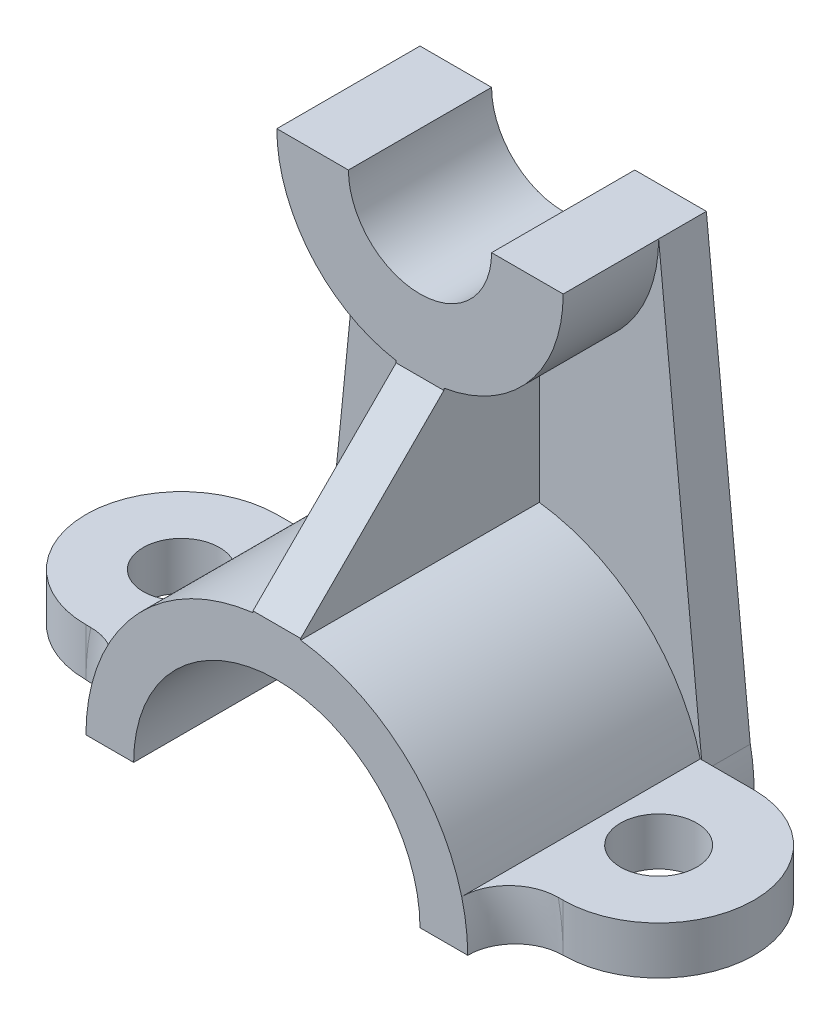
ISO-10303-21;
HEADER;
FILE_DESCRIPTION(('STEP AP214'),'2;1');
FILE_NAME('part.step','',(''),(''),'','','');
FILE_SCHEMA(('AUTOMOTIVE_DESIGN { 1 0 10303 214 1 1 1 1 }'));
ENDSEC;
DATA;
#1=APPLICATION_CONTEXT('core data for automotive mechanical design processes');
#2=APPLICATION_PROTOCOL_DEFINITION('international standard','automotive_design',2000,#1);
#3=PRODUCT_CONTEXT('',#1,'mechanical');
#4=PRODUCT('Part','Part','',(#3));
#5=PRODUCT_RELATED_PRODUCT_CATEGORY('part','',(#4));
#6=PRODUCT_DEFINITION_FORMATION('','',#4);
#7=PRODUCT_DEFINITION_CONTEXT('part definition',#1,'design');
#8=PRODUCT_DEFINITION('design','',#6,#7);
#9=PRODUCT_DEFINITION_SHAPE('','',#8);
#10=(LENGTH_UNIT() NAMED_UNIT(*) SI_UNIT(.MILLI.,.METRE.));
#11=(NAMED_UNIT(*) PLANE_ANGLE_UNIT() SI_UNIT($,.RADIAN.));
#12=(NAMED_UNIT(*) SI_UNIT($,.STERADIAN.) SOLID_ANGLE_UNIT());
#13=UNCERTAINTY_MEASURE_WITH_UNIT(LENGTH_MEASURE(1.E-05),#10,'distance_accuracy_value','');
#14=(GEOMETRIC_REPRESENTATION_CONTEXT(3) GLOBAL_UNCERTAINTY_ASSIGNED_CONTEXT((#13)) GLOBAL_UNIT_ASSIGNED_CONTEXT((#10,
#11,#12)) REPRESENTATION_CONTEXT('',''));
#15=CARTESIAN_POINT('',(0.,0.,0.));
#16=DIRECTION('',(0.,0.,1.));
#17=DIRECTION('',(1.,0.,0.));
#18=AXIS2_PLACEMENT_3D('',#15,#16,#17);
#19=CARTESIAN_POINT('',(0.,0.,-60.));
#20=DIRECTION('',(0.,0.,1.));
#21=DIRECTION('',(1.,0.,0.));
#22=AXIS2_PLACEMENT_3D('',#19,#20,#21);
#23=CYLINDRICAL_SURFACE('',#22,40.);
#24=CARTESIAN_POINT('',(0.,0.,-50.));
#25=DIRECTION('',(0.,0.,-1.));
#26=DIRECTION('',(-1.,0.,0.));
#27=AXIS2_PLACEMENT_3D('',#24,#25,#26);
#28=CIRCLE('',#27,40.);
#29=CARTESIAN_POINT('',(5.,39.6862696659689,-50.));
#30=VERTEX_POINT('',#29);
#31=CARTESIAN_POINT('',(38.7298334620742,10.,-50.));
#32=VERTEX_POINT('',#31);
#33=EDGE_CURVE('E304',#30,#32,#28,.T.);
#34=ORIENTED_EDGE('',*,*,#33,.F.);
#35=DIRECTION('',(0.,0.,1.));
#36=VECTOR('',#35,1.);
#37=CARTESIAN_POINT('',(5.,39.6862696659689,-60.));
#38=LINE('',#37,#36);
#39=CARTESIAN_POINT('',(5.,39.6862696659689,0.));
#40=VERTEX_POINT('',#39);
#41=EDGE_CURVE('E61',#30,#40,#38,.T.);
#42=ORIENTED_EDGE('',*,*,#41,.T.);
#43=CARTESIAN_POINT('',(0.,0.,0.));
#44=DIRECTION('',(0.,0.,1.));
#45=DIRECTION('',(1.,0.,0.));
#46=AXIS2_PLACEMENT_3D('',#43,#44,#45);
#47=CIRCLE('',#46,40.);
#48=CARTESIAN_POINT('',(38.7298334620742,10.,0.));
#49=VERTEX_POINT('',#48);
#50=EDGE_CURVE('E406',#49,#40,#47,.T.);
#51=ORIENTED_EDGE('',*,*,#50,.F.);
#52=DIRECTION('',(0.,0.,1.));
#53=VECTOR('',#52,1.);
#54=CARTESIAN_POINT('',(38.7298334620742,10.,-60.));
#55=LINE('',#54,#53);
#56=EDGE_CURVE('E411',#49,#32,#55,.F.);
#57=ORIENTED_EDGE('',*,*,#56,.T.);
#58=EDGE_LOOP('',(#34,#42,#51,#57));
#59=FACE_BOUND('',#58,.T.);
#60=ADVANCED_FACE('F37',(#59),#23,.T.);
#61=CARTESIAN_POINT('',(0.,0.,-50.));
#62=DIRECTION('',(0.,0.,-1.));
#63=DIRECTION('',(-1.,0.,0.));
#64=AXIS2_PLACEMENT_3D('',#61,#62,#63);
#65=PLANE('',#64);
#66=DIRECTION('',(0.,1.,0.));
#67=VECTOR('',#66,1.);
#68=CARTESIAN_POINT('',(5.,39.,-50.));
#69=LINE('',#68,#67);
#70=CARTESIAN_POINT('',(5.,70.4195685601603,-50.));
#71=VERTEX_POINT('',#70);
#72=EDGE_CURVE('E229',#30,#71,#69,.T.);
#73=ORIENTED_EDGE('',*,*,#72,.F.);
#74=ORIENTED_EDGE('',*,*,#33,.T.);
#75=DIRECTION('',(1.,0.,0.));
#76=VECTOR('',#75,1.);
#77=CARTESIAN_POINT('',(50.,10.,-50.));
#78=LINE('',#77,#76);
#79=CARTESIAN_POINT('',(39.,10.,-50.));
#80=VERTEX_POINT('',#79);
#81=EDGE_CURVE('E323',#32,#80,#78,.T.);
#82=ORIENTED_EDGE('',*,*,#81,.T.);
#83=DIRECTION('',(-0.099503719020999,0.995037190209989,0.));
#84=VECTOR('',#83,1.);
#85=CARTESIAN_POINT('',(39.6039603960396,3.96039603960396,-50.));
#86=LINE('',#85,#84);
#87=CARTESIAN_POINT('',(30.00003206772,99.9996793228004,-50.));
#88=VERTEX_POINT('',#87);
#89=EDGE_CURVE('E300',#80,#88,#86,.T.);
#90=ORIENTED_EDGE('',*,*,#89,.T.);
#91=CARTESIAN_POINT('',(0.,100.,-50.));
#92=DIRECTION('',(0.,0.,-1.));
#93=DIRECTION('',(-1.,0.,0.));
#94=AXIS2_PLACEMENT_3D('',#91,#92,#93);
#95=CIRCLE('',#94,30.0000320694338);
#96=EDGE_CURVE('E297',#88,#71,#95,.T.);
#97=ORIENTED_EDGE('',*,*,#96,.T.);
#98=EDGE_LOOP('',(#73,#74,#82,#90,#97));
#99=FACE_BOUND('',#98,.T.);
#100=ADVANCED_FACE('F497',(#99),#65,.F.);
#101=CARTESIAN_POINT('',(0.,100.,-30.));
#102=DIRECTION('',(0.,0.,-1.));
#103=DIRECTION('',(-1.,0.,0.));
#104=AXIS2_PLACEMENT_3D('',#101,#102,#103);
#105=CYLINDRICAL_SURFACE('',#104,30.0000320694338);
#106=CARTESIAN_POINT('',(0.,100.,-30.));
#107=DIRECTION('',(0.,0.,-1.));
#108=DIRECTION('',(-1.,0.,0.));
#109=AXIS2_PLACEMENT_3D('',#106,#107,#108);
#110=CIRCLE('',#109,30.0000320694338);
#111=CARTESIAN_POINT('',(30.00003206772,99.9996793228004,-30.));
#112=VERTEX_POINT('',#111);
#113=CARTESIAN_POINT('',(5.,70.4195685601603,-30.));
#114=VERTEX_POINT('',#113);
#115=EDGE_CURVE('E291',#112,#114,#110,.T.);
#116=ORIENTED_EDGE('',*,*,#115,.T.);
#117=DIRECTION('',(0.,0.,-1.));
#118=VECTOR('',#117,1.);
#119=CARTESIAN_POINT('',(5.,70.4195685601603,-30.));
#120=LINE('',#119,#118);
#121=EDGE_CURVE('E226',#114,#71,#120,.T.);
#122=ORIENTED_EDGE('',*,*,#121,.T.);
#123=ORIENTED_EDGE('',*,*,#96,.F.);
#124=DIRECTION('',(0.,0.,-1.));
#125=VECTOR('',#124,1.);
#126=CARTESIAN_POINT('',(30.00003206772,99.9996793228004,-30.));
#127=LINE('',#126,#125);
#128=EDGE_CURVE('E293',#112,#88,#127,.T.);
#129=ORIENTED_EDGE('',*,*,#128,.F.);
#130=EDGE_LOOP('',(#116,#122,#123,#129));
#131=FACE_BOUND('',#130,.T.);
#132=ADVANCED_FACE('F502',(#131),#105,.T.);
#133=CARTESIAN_POINT('',(0.,0.,-60.));
#134=DIRECTION('',(0.,0.,1.));
#135=DIRECTION('',(1.,0.,0.));
#136=AXIS2_PLACEMENT_3D('',#133,#134,#135);
#137=CIRCLE('',#136,40.);
#138=CARTESIAN_POINT('',(40.,0.,-60.));
#139=VERTEX_POINT('',#138);
#140=CARTESIAN_POINT('',(39.2079207920792,7.92079207920776,-60.));
#141=VERTEX_POINT('',#140);
#142=EDGE_CURVE('E394',#139,#141,#137,.T.);
#143=ORIENTED_EDGE('',*,*,#142,.T.);
#144=DIRECTION('',(0.,0.,-1.));
#145=VECTOR('',#144,1.);
#146=CARTESIAN_POINT('',(39.2079207920792,7.92079207920781,-50.));
#147=LINE('',#146,#145);
#148=CARTESIAN_POINT('',(39.2079207920792,7.9207920792079,-50.));
#149=VERTEX_POINT('',#148);
#150=EDGE_CURVE('E324',#149,#141,#147,.T.);
#151=ORIENTED_EDGE('',*,*,#150,.F.);
#152=CARTESIAN_POINT('',(0.,0.,-50.));
#153=DIRECTION('',(0.,0.,1.));
#154=DIRECTION('',(1.,0.,0.));
#155=AXIS2_PLACEMENT_3D('',#152,#153,#154);
#156=CIRCLE('',#155,40.);
#157=CARTESIAN_POINT('',(40.,0.,-50.));
#158=VERTEX_POINT('',#157);
#159=EDGE_CURVE('E421',#149,#158,#156,.F.);
#160=ORIENTED_EDGE('',*,*,#159,.T.);
#161=DIRECTION('',(0.,0.,1.));
#162=VECTOR('',#161,1.);
#163=CARTESIAN_POINT('',(40.,0.,-60.));
#164=LINE('',#163,#162);
#165=EDGE_CURVE('E398',#139,#158,#164,.T.);
#166=ORIENTED_EDGE('',*,*,#165,.F.);
#167=EDGE_LOOP('',(#143,#151,#160,#166));
#168=FACE_BOUND('',#167,.T.);
#169=ADVANCED_FACE('F498',(#168),#23,.T.);
#170=DIRECTION('',(0.,0.,1.));
#171=VECTOR('',#170,1.);
#172=CARTESIAN_POINT('',(-5.,39.6862696659689,-60.));
#173=LINE('',#172,#171);
#174=CARTESIAN_POINT('',(-5.,39.6862696659689,-50.));
#175=VERTEX_POINT('',#174);
#176=CARTESIAN_POINT('',(-5.,39.6862696659689,0.));
#177=VERTEX_POINT('',#176);
#178=EDGE_CURVE('E261',#175,#177,#173,.T.);
#179=ORIENTED_EDGE('',*,*,#178,.F.);
#180=CARTESIAN_POINT('',(-38.7298334620742,10.,-50.));
#181=VERTEX_POINT('',#180);
#182=EDGE_CURVE('E305',#181,#175,#28,.T.);
#183=ORIENTED_EDGE('',*,*,#182,.F.);
#184=DIRECTION('',(0.,0.,1.));
#185=VECTOR('',#184,1.);
#186=CARTESIAN_POINT('',(-38.7298334620742,10.,-60.));
#187=LINE('',#186,#185);
#188=CARTESIAN_POINT('',(-38.7298334620742,10.,0.));
#189=VERTEX_POINT('',#188);
#190=EDGE_CURVE('E423',#189,#181,#187,.F.);
#191=ORIENTED_EDGE('',*,*,#190,.F.);
#192=EDGE_CURVE('E53',#177,#189,#47,.T.);
#193=ORIENTED_EDGE('',*,*,#192,.F.);
#194=EDGE_LOOP('',(#179,#183,#191,#193));
#195=FACE_BOUND('',#194,.T.);
#196=ADVANCED_FACE('F495',(#195),#23,.T.);
#197=CARTESIAN_POINT('',(50.,0.,-50.));
#198=DIRECTION('',(0.,0.,1.));
#199=DIRECTION('',(1.,0.,0.));
#200=AXIS2_PLACEMENT_3D('',#197,#198,#199);
#201=PLANE('',#200);
#202=EDGE_CURVE('E302',#149,#80,#86,.T.);
#203=ORIENTED_EDGE('',*,*,#202,.T.);
#204=DIRECTION('',(-1.,0.,0.));
#205=VECTOR('',#204,1.);
#206=CARTESIAN_POINT('',(50.,10.,-50.));
#207=LINE('',#206,#205);
#208=CARTESIAN_POINT('',(50.,10.,-50.));
#209=VERTEX_POINT('',#208);
#210=EDGE_CURVE('E381',#209,#80,#207,.T.);
#211=ORIENTED_EDGE('',*,*,#210,.F.);
#212=DIRECTION('',(0.,1.,0.));
#213=VECTOR('',#212,1.);
#214=CARTESIAN_POINT('',(50.,0.,-50.));
#215=LINE('',#214,#213);
#216=CARTESIAN_POINT('',(50.,0.,-50.));
#217=VERTEX_POINT('',#216);
#218=EDGE_CURVE('E375',#217,#209,#215,.T.);
#219=ORIENTED_EDGE('',*,*,#218,.F.);
#220=DIRECTION('',(-1.,0.,0.));
#221=VECTOR('',#220,1.);
#222=CARTESIAN_POINT('',(50.,0.,-50.));
#223=LINE('',#222,#221);
#224=EDGE_CURVE('E384',#217,#158,#223,.T.);
#225=ORIENTED_EDGE('',*,*,#224,.T.);
#226=ORIENTED_EDGE('',*,*,#159,.F.);
#227=EDGE_LOOP('',(#203,#211,#219,#225,#226));
#228=FACE_BOUND('',#227,.T.);
#229=ADVANCED_FACE('F460',(#228),#201,.F.);
#230=CARTESIAN_POINT('',(0.,0.,0.));
#231=DIRECTION('',(0.,0.,-1.));
#232=DIRECTION('',(-1.,0.,0.));
#233=AXIS2_PLACEMENT_3D('',#230,#231,#232);
#234=TOROIDAL_SURFACE('',#233,50.,10.);
#235=CARTESIAN_POINT('',(0.,0.,-10.));
#236=DIRECTION('',(0.,0.,-1.));
#237=DIRECTION('',(-1.,0.,0.));
#238=AXIS2_PLACEMENT_3D('',#235,#236,#237);
#239=CIRCLE('',#238,50.);
#240=CARTESIAN_POINT('',(48.9897948556636,10.,-10.));
#241=VERTEX_POINT('',#240);
#242=CARTESIAN_POINT('',(50.,0.,-10.));
#243=VERTEX_POINT('',#242);
#244=EDGE_CURVE('E438',#241,#243,#239,.T.);
#245=ORIENTED_EDGE('',*,*,#244,.F.);
#246=CARTESIAN_POINT('',(48.9897948556636,10.,-10.));
#247=CARTESIAN_POINT('',(48.6965351327244,10.,-10.0000275256272));
#248=CARTESIAN_POINT('',(48.4032827992242,10.,-9.9876169739682));
#249=CARTESIAN_POINT('',(47.8188744881541,10.,-9.93817380639994));
#250=CARTESIAN_POINT('',(47.5277184092502,10.,-9.90114238886312));
#251=CARTESIAN_POINT('',(46.9496795639178,10.,-9.80273269970968));
#252=CARTESIAN_POINT('',(46.6627950134873,10.,-9.7413649059811));
#253=CARTESIAN_POINT('',(46.0952040196317,10.,-9.59472469302727));
#254=CARTESIAN_POINT('',(45.8144975261928,10.,-9.50945246739427));
#255=CARTESIAN_POINT('',(45.2611261271584,10.,-9.31553248570147));
#256=CARTESIAN_POINT('',(44.9884651314181,10.,-9.20687357046556));
#257=CARTESIAN_POINT('',(44.4532828996957,10.,-8.96692503558677));
#258=CARTESIAN_POINT('',(44.1907618077213,10.,-8.8356350946808));
#259=CARTESIAN_POINT('',(43.6778158454514,10.,-8.55130912166704));
#260=CARTESIAN_POINT('',(43.427389341787,10.,-8.39827603702705));
#261=CARTESIAN_POINT('',(42.9404624822309,10.,-8.07145900296261));
#262=CARTESIAN_POINT('',(42.7039619917041,10.,-7.89767525420239));
#263=CARTESIAN_POINT('',(42.2478806913687,10.,-7.53146377369933));
#264=CARTESIAN_POINT('',(42.0282183896885,10.,-7.33913755474157));
#265=CARTESIAN_POINT('',(41.6061817078078,10.,-6.93638007729185));
#266=CARTESIAN_POINT('',(41.403806575286,10.,-6.72594960748075));
#267=CARTESIAN_POINT('',(41.0179793201145,10.,-6.2884262654633));
#268=CARTESIAN_POINT('',(40.83452568252,10.,-6.06133472971634));
#269=CARTESIAN_POINT('',(40.4880563245027,10.,-5.59206082815244));
#270=CARTESIAN_POINT('',(40.3250401305764,10.,-5.34987881215297));
#271=CARTESIAN_POINT('',(40.0243087400953,10.,-4.85781383055224));
#272=CARTESIAN_POINT('',(39.886103159868,10.,-4.60823052442453));
#273=CARTESIAN_POINT('',(39.6317390210153,10.,-4.09806587528053));
#274=CARTESIAN_POINT('',(39.5155802925117,10.,-3.83748461702597));
#275=CARTESIAN_POINT('',(39.3063512819457,10.,-3.30724403071978));
#276=CARTESIAN_POINT('',(39.21327827334,10.,-3.0375857789846));
#277=CARTESIAN_POINT('',(39.0510532656436,10.,-2.49116979462146));
#278=CARTESIAN_POINT('',(38.9819005166396,10.,-2.21441228485139));
#279=CARTESIAN_POINT('',(38.8698443656933,10.,-1.66417159554101));
#280=CARTESIAN_POINT('',(38.8262242431466,10.,-1.39083417431341));
#281=CARTESIAN_POINT('',(38.7625000155677,10.,-0.841432047008733));
#282=CARTESIAN_POINT('',(38.742395526575,10.,-0.56536738553594));
#283=CARTESIAN_POINT('',(38.7258839545341,10.,-0.0121224640339545));
#284=CARTESIAN_POINT('',(38.7295119482925,10.,0.265058841893455));
#285=CARTESIAN_POINT('',(38.7604708791107,10.,0.818122880292896));
#286=CARTESIAN_POINT('',(38.7878042720272,10.,1.09400547524225));
#287=CARTESIAN_POINT('',(38.8269515704382,10.,1.36820586740086));
#288=B_SPLINE_CURVE_WITH_KNOTS('',3,(#246,#247,#248,#249,#250,#251,#252,#253,#254,#255,#256,
#257,#258,#259,#260,#261,#262,#263,#264,#265,#266,#267,#268,#269,#270,#271,#272,#273,#274,#275,
#276,#277,#278,#279,#280,#281,#282,#283,#284,#285,#286,#287),.UNSPECIFIED.,.F.,.F.,(4,2,2,2,2,2,
2,2,2,2,2,2,2,2,2,2,2,2,2,2,4),(0.,0.879506381359337,1.75896995760201,2.63805529619199,
3.51713351563304,4.39663212903862,5.27614322856463,6.15553521644182,7.03491870106213,
7.90973519840739,8.78451360513976,9.65922191850005,10.5339099624916,11.3887400641032,
12.2435635787026,13.0982860860885,13.9529817950245,14.7823658260779,15.6117363148579,
16.4423328967912,17.2730155380211),.UNSPECIFIED.);
#289=EDGE_CURVE('E46',#241,#49,#288,.T.);
#290=ORIENTED_EDGE('',*,*,#289,.T.);
#291=CARTESIAN_POINT('',(40.,0.,0.));
#292=VERTEX_POINT('',#291);
#293=EDGE_CURVE('E403',#292,#49,#47,.T.);
#294=ORIENTED_EDGE('',*,*,#293,.F.);
#295=CARTESIAN_POINT('',(50.,0.,0.));
#296=DIRECTION('',(0.,-1.,0.));
#297=DIRECTION('',(0.,0.,-1.));
#298=AXIS2_PLACEMENT_3D('',#295,#296,#297);
#299=CIRCLE('',#298,10.);
#300=EDGE_CURVE('E11',#292,#243,#299,.T.);
#301=ORIENTED_EDGE('',*,*,#300,.T.);
#302=EDGE_LOOP('',(#245,#290,#294,#301));
#303=FACE_BOUND('',#302,.T.);
#304=ADVANCED_FACE('F39',(#303),#234,.F.);
#305=CARTESIAN_POINT('',(0.,0.,0.));
#306=DIRECTION('',(0.,0.,1.));
#307=DIRECTION('',(1.,0.,0.));
#308=AXIS2_PLACEMENT_3D('',#305,#306,#307);
#309=TOROIDAL_SURFACE('',#308,50.,10.);
#310=CARTESIAN_POINT('',(0.,0.,-10.));
#311=DIRECTION('',(0.,0.,1.));
#312=DIRECTION('',(1.,0.,0.));
#313=AXIS2_PLACEMENT_3D('',#310,#311,#312);
#314=CIRCLE('',#313,50.);
#315=CARTESIAN_POINT('',(-50.,0.,-10.));
#316=VERTEX_POINT('',#315);
#317=CARTESIAN_POINT('',(-48.9897948556636,10.,-10.));
#318=VERTEX_POINT('',#317);
#319=EDGE_CURVE('E426',#316,#318,#314,.F.);
#320=ORIENTED_EDGE('',*,*,#319,.F.);
#321=CARTESIAN_POINT('',(-50.,0.,0.));
#322=DIRECTION('',(0.,-1.,0.));
#323=DIRECTION('',(0.,0.,-1.));
#324=AXIS2_PLACEMENT_3D('',#321,#322,#323);
#325=CIRCLE('',#324,10.);
#326=CARTESIAN_POINT('',(-40.,0.,0.));
#327=VERTEX_POINT('',#326);
#328=EDGE_CURVE('E429',#316,#327,#325,.T.);
#329=ORIENTED_EDGE('',*,*,#328,.T.);
#330=EDGE_CURVE('E401',#189,#327,#47,.T.);
#331=ORIENTED_EDGE('',*,*,#330,.F.);
#332=CARTESIAN_POINT('',(-48.9897948556636,10.,-10.));
#333=CARTESIAN_POINT('',(-48.6965351327244,10.,-10.0000275256272));
#334=CARTESIAN_POINT('',(-48.4032827992242,10.,-9.9876169739682));
#335=CARTESIAN_POINT('',(-47.8188744881541,10.,-9.93817380639994));
#336=CARTESIAN_POINT('',(-47.5277184092502,10.,-9.90114238886312));
#337=CARTESIAN_POINT('',(-46.9496795639179,10.,-9.80273269970968));
#338=CARTESIAN_POINT('',(-46.6627950134873,10.,-9.7413649059811));
#339=CARTESIAN_POINT('',(-46.0952040196317,10.,-9.59472469302727));
#340=CARTESIAN_POINT('',(-45.8144975261928,10.,-9.50945246739427));
#341=CARTESIAN_POINT('',(-45.2611261271584,10.,-9.31553248570148));
#342=CARTESIAN_POINT('',(-44.9884651314181,10.,-9.20687357046557));
#343=CARTESIAN_POINT('',(-44.4532828996957,10.,-8.96692503558678));
#344=CARTESIAN_POINT('',(-44.1907618077213,10.,-8.83563509468081));
#345=CARTESIAN_POINT('',(-43.6778158454514,10.,-8.55130912166705));
#346=CARTESIAN_POINT('',(-43.427389341787,10.,-8.39827603702706));
#347=CARTESIAN_POINT('',(-42.9404624822309,10.,-8.07145900296262));
#348=CARTESIAN_POINT('',(-42.7039619917041,10.,-7.8976752542024));
#349=CARTESIAN_POINT('',(-42.2478806913687,10.,-7.53146377369935));
#350=CARTESIAN_POINT('',(-42.0282183896885,10.,-7.33913755474159));
#351=CARTESIAN_POINT('',(-41.6061817078079,10.,-6.93638007729187));
#352=CARTESIAN_POINT('',(-41.403806575286,10.,-6.72594960748077));
#353=CARTESIAN_POINT('',(-41.0179793201145,10.,-6.28842626546331));
#354=CARTESIAN_POINT('',(-40.83452568252,10.,-6.06133472971636));
#355=CARTESIAN_POINT('',(-40.4880563245028,10.,-5.59206082815246));
#356=CARTESIAN_POINT('',(-40.3250401305765,10.,-5.34987881215298));
#357=CARTESIAN_POINT('',(-40.0243087400953,10.,-4.85781383055225));
#358=CARTESIAN_POINT('',(-39.886103159868,10.,-4.60823052442454));
#359=CARTESIAN_POINT('',(-39.6317390210153,10.,-4.09806587528055));
#360=CARTESIAN_POINT('',(-39.5155802925117,10.,-3.83748461702598));
#361=CARTESIAN_POINT('',(-39.3063512819457,10.,-3.30724403071979));
#362=CARTESIAN_POINT('',(-39.21327827334,10.,-3.03758577898462));
#363=CARTESIAN_POINT('',(-39.0510532656436,10.,-2.49116979462148));
#364=CARTESIAN_POINT('',(-38.9819005166396,10.,-2.21441228485141));
#365=CARTESIAN_POINT('',(-38.8698443656933,10.,-1.66417159554104));
#366=CARTESIAN_POINT('',(-38.8262242431466,10.,-1.39083417431343));
#367=CARTESIAN_POINT('',(-38.7625000155677,10.,-0.841432047008754));
#368=CARTESIAN_POINT('',(-38.742395526575,10.,-0.565367385535961));
#369=CARTESIAN_POINT('',(-38.7258839545341,10.,-0.012122464033977));
#370=CARTESIAN_POINT('',(-38.7295119482925,10.,0.265058841893432));
#371=CARTESIAN_POINT('',(-38.7604708791107,10.,0.818122880292873));
#372=CARTESIAN_POINT('',(-38.7878042720272,10.,1.09400547524223));
#373=CARTESIAN_POINT('',(-38.8269515704382,10.,1.36820586740083));
#374=B_SPLINE_CURVE_WITH_KNOTS('',3,(#332,#333,#334,#335,#336,#337,#338,#339,#340,#341,#342,
#343,#344,#345,#346,#347,#348,#349,#350,#351,#352,#353,#354,#355,#356,#357,#358,#359,#360,#361,
#362,#363,#364,#365,#366,#367,#368,#369,#370,#371,#372,#373),.UNSPECIFIED.,.F.,.F.,(4,2,2,2,2,2,
2,2,2,2,2,2,2,2,2,2,2,2,2,2,4),(0.,0.879506381359337,1.75896995760201,2.63805529619199,
3.51713351563304,4.39663212903861,5.27614322856462,6.15553521644181,7.03491870106212,
7.90973519840738,8.78451360513975,9.65922191850003,10.5339099624916,11.3887400641032,
12.2435635787026,13.0982860860884,13.9529817950245,14.7823658260779,15.6117363148579,
16.4423328967912,17.2730155380211),.UNSPECIFIED.);
#375=EDGE_CURVE('E431',#189,#318,#374,.F.);
#376=ORIENTED_EDGE('',*,*,#375,.T.);
#377=EDGE_LOOP('',(#320,#329,#331,#376));
#378=FACE_BOUND('',#377,.T.);
#379=ADVANCED_FACE('F439',(#378),#309,.F.);
#380=DIRECTION('',(0.,0.,-1.));
#381=VECTOR('',#380,1.);
#382=CARTESIAN_POINT('',(-39.2079207920792,7.92079207920781,-50.));
#383=LINE('',#382,#381);
#384=CARTESIAN_POINT('',(-39.2079207920792,7.92079207920781,-50.));
#385=VERTEX_POINT('',#384);
#386=CARTESIAN_POINT('',(-39.2079207920792,7.92079207920781,-60.));
#387=VERTEX_POINT('',#386);
#388=EDGE_CURVE('E321',#385,#387,#383,.T.);
#389=ORIENTED_EDGE('',*,*,#388,.T.);
#390=CARTESIAN_POINT('',(-40.,0.,-60.));
#391=VERTEX_POINT('',#390);
#392=EDGE_CURVE('E391',#387,#391,#137,.T.);
#393=ORIENTED_EDGE('',*,*,#392,.T.);
#394=DIRECTION('',(0.,0.,1.));
#395=VECTOR('',#394,1.);
#396=CARTESIAN_POINT('',(-40.,0.,-60.));
#397=LINE('',#396,#395);
#398=CARTESIAN_POINT('',(-40.,0.,-50.));
#399=VERTEX_POINT('',#398);
#400=EDGE_CURVE('E414',#391,#399,#397,.T.);
#401=ORIENTED_EDGE('',*,*,#400,.T.);
#402=CARTESIAN_POINT('',(0.,0.,-50.));
#403=DIRECTION('',(0.,0.,-1.));
#404=DIRECTION('',(-1.,0.,0.));
#405=AXIS2_PLACEMENT_3D('',#402,#403,#404);
#406=CIRCLE('',#405,40.);
#407=EDGE_CURVE('E370',#385,#399,#406,.F.);
#408=ORIENTED_EDGE('',*,*,#407,.F.);
#409=EDGE_LOOP('',(#389,#393,#401,#408));
#410=FACE_BOUND('',#409,.T.);
#411=ADVANCED_FACE('F493',(#410),#23,.T.);
#412=CARTESIAN_POINT('',(0.,0.,-60.));
#413=DIRECTION('',(0.,-1.,0.));
#414=DIRECTION('',(0.,0.,-1.));
#415=AXIS2_PLACEMENT_3D('',#412,#413,#414);
#416=PLANE('',#415);
#417=CARTESIAN_POINT('',(50.,0.,-30.));
#418=DIRECTION('',(0.,1.,0.));
#419=DIRECTION('',(0.,0.,1.));
#420=AXIS2_PLACEMENT_3D('',#417,#418,#419);
#421=CIRCLE('',#420,8.);
#422=CARTESIAN_POINT('',(50.,0.,-22.));
#423=VERTEX_POINT('',#422);
#424=EDGE_CURVE('E347',#423,#423,#421,.T.);
#425=ORIENTED_EDGE('',*,*,#424,.T.);
#426=EDGE_LOOP('',(#425));
#427=FACE_BOUND('',#426,.T.);
#428=ORIENTED_EDGE('',*,*,#300,.F.);
#429=DIRECTION('',(1.,0.,0.));
#430=VECTOR('',#429,1.);
#431=CARTESIAN_POINT('',(0.,0.,0.));
#432=LINE('',#431,#430);
#433=CARTESIAN_POINT('',(30.,0.,0.));
#434=VERTEX_POINT('',#433);
#435=EDGE_CURVE('E387',#434,#292,#432,.T.);
#436=ORIENTED_EDGE('',*,*,#435,.F.);
#437=DIRECTION('',(0.,0.,1.));
#438=VECTOR('',#437,1.);
#439=CARTESIAN_POINT('',(30.,0.,-60.));
#440=LINE('',#439,#438);
#441=CARTESIAN_POINT('',(30.,0.,-60.));
#442=VERTEX_POINT('',#441);
#443=EDGE_CURVE('E409',#442,#434,#440,.T.);
#444=ORIENTED_EDGE('',*,*,#443,.F.);
#445=DIRECTION('',(1.,0.,0.));
#446=VECTOR('',#445,1.);
#447=CARTESIAN_POINT('',(0.,0.,-60.));
#448=LINE('',#447,#446);
#449=EDGE_CURVE('E388',#442,#139,#448,.T.);
#450=ORIENTED_EDGE('',*,*,#449,.T.);
#451=ORIENTED_EDGE('',*,*,#165,.T.);
#452=ORIENTED_EDGE('',*,*,#224,.F.);
#453=CARTESIAN_POINT('',(50.,0.,-30.));
#454=DIRECTION('',(0.,1.,0.));
#455=DIRECTION('',(0.,0.,1.));
#456=AXIS2_PLACEMENT_3D('',#453,#454,#455);
#457=CIRCLE('',#456,20.);
#458=EDGE_CURVE('E344',#243,#217,#457,.T.);
#459=ORIENTED_EDGE('',*,*,#458,.F.);
#460=EDGE_LOOP('',(#428,#436,#444,#450,#451,#452,#459));
#461=FACE_BOUND('',#460,.T.);
#462=ADVANCED_FACE('F478',(#427,#461),#416,.T.);
#463=CARTESIAN_POINT('',(0.,0.,-60.));
#464=DIRECTION('',(0.,0.,1.));
#465=DIRECTION('',(1.,0.,0.));
#466=AXIS2_PLACEMENT_3D('',#463,#464,#465);
#467=CYLINDRICAL_SURFACE('',#466,30.);
#468=CARTESIAN_POINT('',(0.,0.,0.));
#469=DIRECTION('',(0.,0.,1.));
#470=DIRECTION('',(1.,0.,0.));
#471=AXIS2_PLACEMENT_3D('',#468,#469,#470);
#472=CIRCLE('',#471,30.);
#473=CARTESIAN_POINT('',(-30.,0.,0.));
#474=VERTEX_POINT('',#473);
#475=EDGE_CURVE('E392',#434,#474,#472,.T.);
#476=ORIENTED_EDGE('',*,*,#475,.T.);
#477=DIRECTION('',(0.,0.,1.));
#478=VECTOR('',#477,1.);
#479=CARTESIAN_POINT('',(-30.,0.,-60.));
#480=LINE('',#479,#478);
#481=CARTESIAN_POINT('',(-30.,0.,-60.));
#482=VERTEX_POINT('',#481);
#483=EDGE_CURVE('E412',#482,#474,#480,.T.);
#484=ORIENTED_EDGE('',*,*,#483,.F.);
#485=CARTESIAN_POINT('',(0.,0.,-60.));
#486=DIRECTION('',(0.,0.,1.));
#487=DIRECTION('',(1.,0.,0.));
#488=AXIS2_PLACEMENT_3D('',#485,#486,#487);
#489=CIRCLE('',#488,30.);
#490=EDGE_CURVE('E396',#442,#482,#489,.T.);
#491=ORIENTED_EDGE('',*,*,#490,.F.);
#492=ORIENTED_EDGE('',*,*,#443,.T.);
#493=EDGE_LOOP('',(#476,#484,#491,#492));
#494=FACE_BOUND('',#493,.T.);
#495=ADVANCED_FACE('F514',(#494),#467,.F.);
#496=CARTESIAN_POINT('',(-50.,0.,-30.));
#497=DIRECTION('',(0.,-1.,0.));
#498=DIRECTION('',(0.,0.,1.));
#499=AXIS2_PLACEMENT_3D('',#496,#497,#498);
#500=CIRCLE('',#499,20.);
#501=CARTESIAN_POINT('',(-50.,0.,-50.));
#502=VERTEX_POINT('',#501);
#503=EDGE_CURVE('E337',#316,#502,#500,.T.);
#504=ORIENTED_EDGE('',*,*,#503,.T.);
#505=DIRECTION('',(1.,0.,0.));
#506=VECTOR('',#505,1.);
#507=CARTESIAN_POINT('',(-50.,0.,-50.));
#508=LINE('',#507,#506);
#509=EDGE_CURVE('E361',#502,#399,#508,.T.);
#510=ORIENTED_EDGE('',*,*,#509,.T.);
#511=ORIENTED_EDGE('',*,*,#400,.F.);
#512=EDGE_CURVE('E393',#391,#482,#448,.T.);
#513=ORIENTED_EDGE('',*,*,#512,.T.);
#514=ORIENTED_EDGE('',*,*,#483,.T.);
#515=EDGE_CURVE('E402',#327,#474,#432,.T.);
#516=ORIENTED_EDGE('',*,*,#515,.F.);
#517=ORIENTED_EDGE('',*,*,#328,.F.);
#518=EDGE_LOOP('',(#504,#510,#511,#513,#514,#516,#517));
#519=FACE_BOUND('',#518,.T.);
#520=CARTESIAN_POINT('',(-50.,0.,-30.));
#521=DIRECTION('',(0.,-1.,0.));
#522=DIRECTION('',(0.,0.,1.));
#523=AXIS2_PLACEMENT_3D('',#520,#521,#522);
#524=CIRCLE('',#523,8.);
#525=CARTESIAN_POINT('',(-50.,0.,-22.));
#526=VERTEX_POINT('',#525);
#527=EDGE_CURVE('E334',#526,#526,#524,.T.);
#528=ORIENTED_EDGE('',*,*,#527,.F.);
#529=EDGE_LOOP('',(#528));
#530=FACE_BOUND('',#529,.T.);
#531=ADVANCED_FACE('F516',(#519,#530),#416,.T.);
#532=CARTESIAN_POINT('',(0.,0.,-60.));
#533=DIRECTION('',(0.,0.,1.));
#534=DIRECTION('',(1.,0.,0.));
#535=AXIS2_PLACEMENT_3D('',#532,#533,#534);
#536=PLANE('',#535);
#537=DIRECTION('',(0.099503719020999,0.995037190209989,0.));
#538=VECTOR('',#537,1.);
#539=CARTESIAN_POINT('',(-39.6039603960396,3.96039603960396,-60.));
#540=LINE('',#539,#538);
#541=CARTESIAN_POINT('',(-30.,100.,-60.));
#542=VERTEX_POINT('',#541);
#543=EDGE_CURVE('E319',#387,#542,#540,.T.);
#544=ORIENTED_EDGE('',*,*,#543,.T.);
#545=DIRECTION('',(-1.,0.,0.));
#546=VECTOR('',#545,1.);
#547=CARTESIAN_POINT('',(0.,100.,-60.));
#548=LINE('',#547,#546);
#549=CARTESIAN_POINT('',(-15.,100.,-60.));
#550=VERTEX_POINT('',#549);
#551=EDGE_CURVE('E265',#550,#542,#548,.T.);
#552=ORIENTED_EDGE('',*,*,#551,.F.);
#553=CARTESIAN_POINT('',(0.,100.,-60.));
#554=DIRECTION('',(0.,0.,-1.));
#555=DIRECTION('',(-1.,0.,0.));
#556=AXIS2_PLACEMENT_3D('',#553,#554,#555);
#557=CIRCLE('',#556,15.);
#558=CARTESIAN_POINT('',(15.,100.,-60.));
#559=VERTEX_POINT('',#558);
#560=EDGE_CURVE('E296',#559,#550,#557,.T.);
#561=ORIENTED_EDGE('',*,*,#560,.F.);
#562=DIRECTION('',(1.,0.,0.));
#563=VECTOR('',#562,1.);
#564=CARTESIAN_POINT('',(0.,100.,-60.));
#565=LINE('',#564,#563);
#566=CARTESIAN_POINT('',(30.,100.,-60.));
#567=VERTEX_POINT('',#566);
#568=EDGE_CURVE('E314',#559,#567,#565,.T.);
#569=ORIENTED_EDGE('',*,*,#568,.T.);
#570=DIRECTION('',(-0.099503719020999,0.995037190209989,0.));
#571=VECTOR('',#570,1.);
#572=CARTESIAN_POINT('',(39.6039603960396,3.96039603960396,-60.));
#573=LINE('',#572,#571);
#574=EDGE_CURVE('E317',#141,#567,#573,.T.);
#575=ORIENTED_EDGE('',*,*,#574,.F.);
#576=ORIENTED_EDGE('',*,*,#142,.F.);
#577=ORIENTED_EDGE('',*,*,#449,.F.);
#578=ORIENTED_EDGE('',*,*,#490,.T.);
#579=ORIENTED_EDGE('',*,*,#512,.F.);
#580=ORIENTED_EDGE('',*,*,#392,.F.);
#581=EDGE_LOOP('',(#544,#552,#561,#569,#575,#576,#577,#578,#579,#580));
#582=FACE_BOUND('',#581,.T.);
#583=ADVANCED_FACE('F583',(#582),#536,.F.);
#584=CARTESIAN_POINT('',(0.,0.,0.));
#585=DIRECTION('',(0.,0.,1.));
#586=DIRECTION('',(1.,0.,0.));
#587=AXIS2_PLACEMENT_3D('',#584,#585,#586);
#588=PLANE('',#587);
#589=ORIENTED_EDGE('',*,*,#50,.T.);
#590=DIRECTION('',(0.,-1.,0.));
#591=VECTOR('',#590,1.);
#592=CARTESIAN_POINT('',(5.,40.,0.));
#593=LINE('',#592,#591);
#594=CARTESIAN_POINT('',(5.,40.,0.));
#595=VERTEX_POINT('',#594);
#596=EDGE_CURVE('E257',#595,#40,#593,.T.);
#597=ORIENTED_EDGE('',*,*,#596,.F.);
#598=DIRECTION('',(-1.,0.,0.));
#599=VECTOR('',#598,1.);
#600=CARTESIAN_POINT('',(5.,40.,0.));
#601=LINE('',#600,#599);
#602=CARTESIAN_POINT('',(-5.,40.,0.));
#603=VERTEX_POINT('',#602);
#604=EDGE_CURVE('E241',#595,#603,#601,.T.);
#605=ORIENTED_EDGE('',*,*,#604,.T.);
#606=DIRECTION('',(0.,-1.,0.));
#607=VECTOR('',#606,1.);
#608=CARTESIAN_POINT('',(-5.,40.,0.));
#609=LINE('',#608,#607);
#610=EDGE_CURVE('E249',#603,#177,#609,.T.);
#611=ORIENTED_EDGE('',*,*,#610,.T.);
#612=ORIENTED_EDGE('',*,*,#192,.T.);
#613=ORIENTED_EDGE('',*,*,#330,.T.);
#614=ORIENTED_EDGE('',*,*,#515,.T.);
#615=ORIENTED_EDGE('',*,*,#475,.F.);
#616=ORIENTED_EDGE('',*,*,#435,.T.);
#617=ORIENTED_EDGE('',*,*,#293,.T.);
#618=EDGE_LOOP('',(#589,#597,#605,#611,#612,#613,#614,#615,#616,#617));
#619=FACE_BOUND('',#618,.T.);
#620=ADVANCED_FACE('F486',(#619),#588,.T.);
#621=CARTESIAN_POINT('',(50.,0.,-10.));
#622=DIRECTION('',(0.,0.,-1.));
#623=DIRECTION('',(-1.,0.,0.));
#624=AXIS2_PLACEMENT_3D('',#621,#622,#623);
#625=PLANE('',#624);
#626=DIRECTION('',(-1.,0.,0.));
#627=VECTOR('',#626,1.);
#628=CARTESIAN_POINT('',(50.,10.,-10.));
#629=LINE('',#628,#627);
#630=CARTESIAN_POINT('',(50.,10.,-10.));
#631=VERTEX_POINT('',#630);
#632=EDGE_CURVE('E378',#631,#241,#629,.T.);
#633=ORIENTED_EDGE('',*,*,#632,.T.);
#634=ORIENTED_EDGE('',*,*,#244,.T.);
#635=DIRECTION('',(0.,-1.,0.));
#636=VECTOR('',#635,1.);
#637=CARTESIAN_POINT('',(50.,0.,-10.));
#638=LINE('',#637,#636);
#639=EDGE_CURVE('E372',#631,#243,#638,.T.);
#640=ORIENTED_EDGE('',*,*,#639,.F.);
#641=EDGE_LOOP('',(#633,#634,#640));
#642=FACE_BOUND('',#641,.T.);
#643=ADVANCED_FACE('F458',(#642),#625,.F.);
#644=CARTESIAN_POINT('',(50.,10.,-10.));
#645=DIRECTION('',(0.,-1.,0.));
#646=DIRECTION('',(0.,0.,-1.));
#647=AXIS2_PLACEMENT_3D('',#644,#645,#646);
#648=PLANE('',#647);
#649=CARTESIAN_POINT('',(50.,10.,-30.));
#650=DIRECTION('',(0.,1.,0.));
#651=DIRECTION('',(0.,0.,1.));
#652=AXIS2_PLACEMENT_3D('',#649,#650,#651);
#653=CIRCLE('',#652,8.);
#654=CARTESIAN_POINT('',(50.,10.,-22.));
#655=VERTEX_POINT('',#654);
#656=EDGE_CURVE('E348',#655,#655,#653,.T.);
#657=ORIENTED_EDGE('',*,*,#656,.F.);
#658=EDGE_LOOP('',(#657));
#659=FACE_BOUND('',#658,.T.);
#660=ORIENTED_EDGE('',*,*,#56,.F.);
#661=ORIENTED_EDGE('',*,*,#289,.F.);
#662=ORIENTED_EDGE('',*,*,#632,.F.);
#663=CARTESIAN_POINT('',(50.,10.,-30.));
#664=DIRECTION('',(0.,1.,0.));
#665=DIRECTION('',(0.,0.,1.));
#666=AXIS2_PLACEMENT_3D('',#663,#664,#665);
#667=CIRCLE('',#666,20.);
#668=EDGE_CURVE('E340',#631,#209,#667,.T.);
#669=ORIENTED_EDGE('',*,*,#668,.T.);
#670=ORIENTED_EDGE('',*,*,#210,.T.);
#671=ORIENTED_EDGE('',*,*,#81,.F.);
#672=EDGE_LOOP('',(#660,#661,#662,#669,#670,#671));
#673=FACE_BOUND('',#672,.T.);
#674=ADVANCED_FACE('F453',(#659,#673),#648,.F.);
#675=CARTESIAN_POINT('',(-50.,0.,-10.));
#676=DIRECTION('',(0.,0.,1.));
#677=DIRECTION('',(1.,0.,0.));
#678=AXIS2_PLACEMENT_3D('',#675,#676,#677);
#679=PLANE('',#678);
#680=DIRECTION('',(0.,-1.,0.));
#681=VECTOR('',#680,1.);
#682=CARTESIAN_POINT('',(-50.,0.,-10.));
#683=LINE('',#682,#681);
#684=CARTESIAN_POINT('',(-50.,10.,-10.));
#685=VERTEX_POINT('',#684);
#686=EDGE_CURVE('E351',#685,#316,#683,.T.);
#687=ORIENTED_EDGE('',*,*,#686,.T.);
#688=ORIENTED_EDGE('',*,*,#319,.T.);
#689=DIRECTION('',(1.,0.,0.));
#690=VECTOR('',#689,1.);
#691=CARTESIAN_POINT('',(-50.,10.,-10.));
#692=LINE('',#691,#690);
#693=EDGE_CURVE('E367',#685,#318,#692,.T.);
#694=ORIENTED_EDGE('',*,*,#693,.F.);
#695=EDGE_LOOP('',(#687,#688,#694));
#696=FACE_BOUND('',#695,.T.);
#697=ADVANCED_FACE('F448',(#696),#679,.T.);
#698=CARTESIAN_POINT('',(-50.,10.,-10.));
#699=DIRECTION('',(0.,1.,0.));
#700=DIRECTION('',(0.,0.,1.));
#701=AXIS2_PLACEMENT_3D('',#698,#699,#700);
#702=PLANE('',#701);
#703=CARTESIAN_POINT('',(-50.,10.,-30.));
#704=DIRECTION('',(0.,-1.,0.));
#705=DIRECTION('',(0.,0.,1.));
#706=AXIS2_PLACEMENT_3D('',#703,#704,#705);
#707=CIRCLE('',#706,8.);
#708=CARTESIAN_POINT('',(-50.,10.,-22.));
#709=VERTEX_POINT('',#708);
#710=EDGE_CURVE('E333',#709,#709,#707,.T.);
#711=ORIENTED_EDGE('',*,*,#710,.T.);
#712=EDGE_LOOP('',(#711));
#713=FACE_BOUND('',#712,.T.);
#714=ORIENTED_EDGE('',*,*,#693,.T.);
#715=ORIENTED_EDGE('',*,*,#375,.F.);
#716=ORIENTED_EDGE('',*,*,#190,.T.);
#717=DIRECTION('',(1.,0.,0.));
#718=VECTOR('',#717,1.);
#719=CARTESIAN_POINT('',(-50.,10.,-50.));
#720=LINE('',#719,#718);
#721=CARTESIAN_POINT('',(-39.,10.,-50.));
#722=VERTEX_POINT('',#721);
#723=EDGE_CURVE('E364',#722,#181,#720,.T.);
#724=ORIENTED_EDGE('',*,*,#723,.F.);
#725=CARTESIAN_POINT('',(-50.,10.,-50.));
#726=VERTEX_POINT('',#725);
#727=EDGE_CURVE('E365',#726,#722,#720,.T.);
#728=ORIENTED_EDGE('',*,*,#727,.F.);
#729=CARTESIAN_POINT('',(-50.,10.,-30.));
#730=DIRECTION('',(0.,-1.,0.));
#731=DIRECTION('',(0.,0.,1.));
#732=AXIS2_PLACEMENT_3D('',#729,#730,#731);
#733=CIRCLE('',#732,20.);
#734=EDGE_CURVE('E338',#685,#726,#733,.T.);
#735=ORIENTED_EDGE('',*,*,#734,.F.);
#736=EDGE_LOOP('',(#714,#715,#716,#724,#728,#735));
#737=FACE_BOUND('',#736,.T.);
#738=ADVANCED_FACE('F442',(#713,#737),#702,.T.);
#739=CARTESIAN_POINT('',(-50.,0.,-50.));
#740=DIRECTION('',(0.,0.,-1.));
#741=DIRECTION('',(-1.,0.,0.));
#742=AXIS2_PLACEMENT_3D('',#739,#740,#741);
#743=PLANE('',#742);
#744=DIRECTION('',(0.099503719020999,0.995037190209989,0.));
#745=VECTOR('',#744,1.);
#746=CARTESIAN_POINT('',(-39.6039603960396,3.96039603960396,-50.));
#747=LINE('',#746,#745);
#748=EDGE_CURVE('E309',#385,#722,#747,.T.);
#749=ORIENTED_EDGE('',*,*,#748,.F.);
#750=ORIENTED_EDGE('',*,*,#407,.T.);
#751=ORIENTED_EDGE('',*,*,#509,.F.);
#752=DIRECTION('',(0.,1.,0.));
#753=VECTOR('',#752,1.);
#754=CARTESIAN_POINT('',(-50.,0.,-50.));
#755=LINE('',#754,#753);
#756=EDGE_CURVE('E358',#502,#726,#755,.T.);
#757=ORIENTED_EDGE('',*,*,#756,.T.);
#758=ORIENTED_EDGE('',*,*,#727,.T.);
#759=EDGE_LOOP('',(#749,#750,#751,#757,#758));
#760=FACE_BOUND('',#759,.T.);
#761=ADVANCED_FACE('F447',(#760),#743,.T.);
#762=CARTESIAN_POINT('',(50.,0.,-30.));
#763=DIRECTION('',(0.,1.,0.));
#764=DIRECTION('',(0.,0.,1.));
#765=AXIS2_PLACEMENT_3D('',#762,#763,#764);
#766=CYLINDRICAL_SURFACE('',#765,8.);
#767=ORIENTED_EDGE('',*,*,#656,.T.);
#768=EDGE_LOOP('',(#767));
#769=FACE_BOUND('',#768,.T.);
#770=ORIENTED_EDGE('',*,*,#424,.F.);
#771=EDGE_LOOP('',(#770));
#772=FACE_BOUND('',#771,.T.);
#773=ADVANCED_FACE('F625',(#769,#772),#766,.F.);
#774=CARTESIAN_POINT('',(50.,0.,-30.));
#775=DIRECTION('',(0.,1.,0.));
#776=DIRECTION('',(0.,0.,1.));
#777=AXIS2_PLACEMENT_3D('',#774,#775,#776);
#778=CYLINDRICAL_SURFACE('',#777,20.);
#779=ORIENTED_EDGE('',*,*,#668,.F.);
#780=ORIENTED_EDGE('',*,*,#639,.T.);
#781=ORIENTED_EDGE('',*,*,#458,.T.);
#782=ORIENTED_EDGE('',*,*,#218,.T.);
#783=EDGE_LOOP('',(#779,#780,#781,#782));
#784=FACE_BOUND('',#783,.T.);
#785=ADVANCED_FACE('F476',(#784),#778,.T.);
#786=CARTESIAN_POINT('',(-50.,0.,-30.));
#787=DIRECTION('',(0.,1.,0.));
#788=DIRECTION('',(0.,0.,1.));
#789=AXIS2_PLACEMENT_3D('',#786,#787,#788);
#790=CYLINDRICAL_SURFACE('',#789,20.);
#791=ORIENTED_EDGE('',*,*,#734,.T.);
#792=ORIENTED_EDGE('',*,*,#756,.F.);
#793=ORIENTED_EDGE('',*,*,#503,.F.);
#794=ORIENTED_EDGE('',*,*,#686,.F.);
#795=EDGE_LOOP('',(#791,#792,#793,#794));
#796=FACE_BOUND('',#795,.T.);
#797=ADVANCED_FACE('F552',(#796),#790,.T.);
#798=CARTESIAN_POINT('',(-50.,0.,-30.));
#799=DIRECTION('',(0.,1.,0.));
#800=DIRECTION('',(0.,0.,1.));
#801=AXIS2_PLACEMENT_3D('',#798,#799,#800);
#802=CYLINDRICAL_SURFACE('',#801,8.);
#803=ORIENTED_EDGE('',*,*,#710,.F.);
#804=EDGE_LOOP('',(#803));
#805=FACE_BOUND('',#804,.T.);
#806=ORIENTED_EDGE('',*,*,#527,.T.);
#807=EDGE_LOOP('',(#806));
#808=FACE_BOUND('',#807,.T.);
#809=ADVANCED_FACE('F644',(#805,#808),#802,.F.);
#810=ORIENTED_EDGE('',*,*,#182,.T.);
#811=DIRECTION('',(0.,1.,0.));
#812=VECTOR('',#811,1.);
#813=CARTESIAN_POINT('',(-5.,70.9999679305661,-50.));
#814=LINE('',#813,#812);
#815=CARTESIAN_POINT('',(-5.,70.4195685601603,-50.));
#816=VERTEX_POINT('',#815);
#817=EDGE_CURVE('E252',#175,#816,#814,.T.);
#818=ORIENTED_EDGE('',*,*,#817,.T.);
#819=CARTESIAN_POINT('',(-30.00003206772,99.9996793228004,-50.));
#820=VERTEX_POINT('',#819);
#821=EDGE_CURVE('E301',#816,#820,#95,.T.);
#822=ORIENTED_EDGE('',*,*,#821,.T.);
#823=EDGE_CURVE('E308',#722,#820,#747,.T.);
#824=ORIENTED_EDGE('',*,*,#823,.F.);
#825=ORIENTED_EDGE('',*,*,#723,.T.);
#826=EDGE_LOOP('',(#810,#818,#822,#824,#825));
#827=FACE_BOUND('',#826,.T.);
#828=ADVANCED_FACE('F505',(#827),#65,.F.);
#829=CARTESIAN_POINT('',(-39.6039603960396,3.96039603960396,-50.));
#830=DIRECTION('',(-0.995037190209989,0.099503719020999,0.));
#831=DIRECTION('',(-0.099503719020999,-0.995037190209989,0.));
#832=AXIS2_PLACEMENT_3D('',#829,#830,#831);
#833=PLANE('',#832);
#834=ORIENTED_EDGE('',*,*,#543,.F.);
#835=ORIENTED_EDGE('',*,*,#388,.F.);
#836=ORIENTED_EDGE('',*,*,#748,.T.);
#837=ORIENTED_EDGE('',*,*,#823,.T.);
#838=DIRECTION('',(0.,0.,-1.));
#839=VECTOR('',#838,1.);
#840=CARTESIAN_POINT('',(-30.00003206772,99.9996793228004,-30.));
#841=LINE('',#840,#839);
#842=CARTESIAN_POINT('',(-30.00003206772,99.9996793228004,-30.));
#843=VERTEX_POINT('',#842);
#844=EDGE_CURVE('E271',#843,#820,#841,.T.);
#845=ORIENTED_EDGE('',*,*,#844,.F.);
#846=DIRECTION('',(0.099503719020999,0.995037190209989,0.));
#847=VECTOR('',#846,1.);
#848=CARTESIAN_POINT('',(-39.6039603960396,3.96039603960396,-30.));
#849=LINE('',#848,#847);
#850=CARTESIAN_POINT('',(-30.,100.,-30.));
#851=VERTEX_POINT('',#850);
#852=EDGE_CURVE('E266',#843,#851,#849,.T.);
#853=ORIENTED_EDGE('',*,*,#852,.T.);
#854=DIRECTION('',(0.,0.,-1.));
#855=VECTOR('',#854,1.);
#856=CARTESIAN_POINT('',(-30.,100.,-30.));
#857=LINE('',#856,#855);
#858=EDGE_CURVE('E278',#851,#542,#857,.T.);
#859=ORIENTED_EDGE('',*,*,#858,.T.);
#860=EDGE_LOOP('',(#834,#835,#836,#837,#845,#853,#859));
#861=FACE_BOUND('',#860,.T.);
#862=ADVANCED_FACE('F536',(#861),#833,.T.);
#863=CARTESIAN_POINT('',(39.6039603960396,3.96039603960396,-50.));
#864=DIRECTION('',(-0.995037190209989,-0.099503719020999,0.));
#865=DIRECTION('',(0.099503719020999,-0.995037190209989,0.));
#866=AXIS2_PLACEMENT_3D('',#863,#864,#865);
#867=PLANE('',#866);
#868=ORIENTED_EDGE('',*,*,#574,.T.);
#869=DIRECTION('',(0.,0.,-1.));
#870=VECTOR('',#869,1.);
#871=CARTESIAN_POINT('',(30.,100.,-50.));
#872=LINE('',#871,#870);
#873=CARTESIAN_POINT('',(30.,100.,-30.));
#874=VERTEX_POINT('',#873);
#875=EDGE_CURVE('E327',#874,#567,#872,.T.);
#876=ORIENTED_EDGE('',*,*,#875,.F.);
#877=DIRECTION('',(-0.099503719020999,0.995037190209989,0.));
#878=VECTOR('',#877,1.);
#879=CARTESIAN_POINT('',(39.6039603960396,3.96039603960396,-30.));
#880=LINE('',#879,#878);
#881=EDGE_CURVE('E287',#112,#874,#880,.T.);
#882=ORIENTED_EDGE('',*,*,#881,.F.);
#883=ORIENTED_EDGE('',*,*,#128,.T.);
#884=ORIENTED_EDGE('',*,*,#89,.F.);
#885=ORIENTED_EDGE('',*,*,#202,.F.);
#886=ORIENTED_EDGE('',*,*,#150,.T.);
#887=EDGE_LOOP('',(#868,#876,#882,#883,#884,#885,#886));
#888=FACE_BOUND('',#887,.T.);
#889=ADVANCED_FACE('F568',(#888),#867,.F.);
#890=CARTESIAN_POINT('',(0.,100.,-50.));
#891=DIRECTION('',(0.,1.,0.));
#892=DIRECTION('',(0.,0.,1.));
#893=AXIS2_PLACEMENT_3D('',#890,#891,#892);
#894=PLANE('',#893);
#895=ORIENTED_EDGE('',*,*,#568,.F.);
#896=DIRECTION('',(0.,0.,-1.));
#897=VECTOR('',#896,1.);
#898=CARTESIAN_POINT('',(15.,100.,-50.));
#899=LINE('',#898,#897);
#900=CARTESIAN_POINT('',(15.,100.,-30.));
#901=VERTEX_POINT('',#900);
#902=EDGE_CURVE('E312',#901,#559,#899,.T.);
#903=ORIENTED_EDGE('',*,*,#902,.F.);
#904=DIRECTION('',(1.,0.,0.));
#905=VECTOR('',#904,1.);
#906=CARTESIAN_POINT('',(0.,100.,-30.));
#907=LINE('',#906,#905);
#908=EDGE_CURVE('E284',#901,#874,#907,.T.);
#909=ORIENTED_EDGE('',*,*,#908,.T.);
#910=ORIENTED_EDGE('',*,*,#875,.T.);
#911=EDGE_LOOP('',(#895,#903,#909,#910));
#912=FACE_BOUND('',#911,.T.);
#913=ADVANCED_FACE('F573',(#912),#894,.T.);
#914=CARTESIAN_POINT('',(0.,100.,-50.));
#915=DIRECTION('',(0.,0.,-1.));
#916=DIRECTION('',(-1.,0.,0.));
#917=AXIS2_PLACEMENT_3D('',#914,#915,#916);
#918=CYLINDRICAL_SURFACE('',#917,15.);
#919=ORIENTED_EDGE('',*,*,#560,.T.);
#920=DIRECTION('',(0.,0.,-1.));
#921=VECTOR('',#920,1.);
#922=CARTESIAN_POINT('',(-15.,100.,-30.));
#923=LINE('',#922,#921);
#924=CARTESIAN_POINT('',(-15.,100.,-30.));
#925=VERTEX_POINT('',#924);
#926=EDGE_CURVE('E274',#925,#550,#923,.T.);
#927=ORIENTED_EDGE('',*,*,#926,.F.);
#928=CARTESIAN_POINT('',(0.,100.,-30.));
#929=DIRECTION('',(0.,0.,-1.));
#930=DIRECTION('',(-1.,0.,0.));
#931=AXIS2_PLACEMENT_3D('',#928,#929,#930);
#932=CIRCLE('',#931,15.);
#933=EDGE_CURVE('E277',#901,#925,#932,.T.);
#934=ORIENTED_EDGE('',*,*,#933,.F.);
#935=ORIENTED_EDGE('',*,*,#902,.T.);
#936=EDGE_LOOP('',(#919,#927,#934,#935));
#937=FACE_BOUND('',#936,.T.);
#938=ADVANCED_FACE('F578',(#937),#918,.F.);
#939=DIRECTION('',(0.,0.,-1.));
#940=VECTOR('',#939,1.);
#941=CARTESIAN_POINT('',(-5.,70.4195685601603,-30.));
#942=LINE('',#941,#940);
#943=CARTESIAN_POINT('',(-5.,70.4195685601603,-30.));
#944=VERTEX_POINT('',#943);
#945=EDGE_CURVE('E240',#944,#816,#942,.T.);
#946=ORIENTED_EDGE('',*,*,#945,.F.);
#947=EDGE_CURVE('E290',#944,#843,#110,.T.);
#948=ORIENTED_EDGE('',*,*,#947,.T.);
#949=ORIENTED_EDGE('',*,*,#844,.T.);
#950=ORIENTED_EDGE('',*,*,#821,.F.);
#951=EDGE_LOOP('',(#946,#948,#949,#950));
#952=FACE_BOUND('',#951,.T.);
#953=ADVANCED_FACE('F529',(#952),#105,.T.);
#954=CARTESIAN_POINT('',(0.,0.,-30.));
#955=DIRECTION('',(0.,0.,-1.));
#956=DIRECTION('',(-1.,0.,0.));
#957=AXIS2_PLACEMENT_3D('',#954,#955,#956);
#958=PLANE('',#957);
#959=ORIENTED_EDGE('',*,*,#947,.F.);
#960=DIRECTION('',(0.,-1.,0.));
#961=VECTOR('',#960,1.);
#962=CARTESIAN_POINT('',(-5.,69.9999679305661,-30.));
#963=LINE('',#962,#961);
#964=CARTESIAN_POINT('',(-5.,69.9999679305661,-30.));
#965=VERTEX_POINT('',#964);
#966=EDGE_CURVE('E236',#944,#965,#963,.T.);
#967=ORIENTED_EDGE('',*,*,#966,.T.);
#968=DIRECTION('',(-1.,0.,0.));
#969=VECTOR('',#968,1.);
#970=CARTESIAN_POINT('',(5.,69.9999679305661,-30.));
#971=LINE('',#970,#969);
#972=CARTESIAN_POINT('',(5.,69.9999679305661,-30.));
#973=VERTEX_POINT('',#972);
#974=EDGE_CURVE('E232',#973,#965,#971,.T.);
#975=ORIENTED_EDGE('',*,*,#974,.F.);
#976=DIRECTION('',(0.,-1.,0.));
#977=VECTOR('',#976,1.);
#978=CARTESIAN_POINT('',(5.,69.9999679305661,-30.));
#979=LINE('',#978,#977);
#980=EDGE_CURVE('E218',#114,#973,#979,.T.);
#981=ORIENTED_EDGE('',*,*,#980,.F.);
#982=ORIENTED_EDGE('',*,*,#115,.F.);
#983=ORIENTED_EDGE('',*,*,#881,.T.);
#984=ORIENTED_EDGE('',*,*,#908,.F.);
#985=ORIENTED_EDGE('',*,*,#933,.T.);
#986=DIRECTION('',(-1.,0.,0.));
#987=VECTOR('',#986,1.);
#988=CARTESIAN_POINT('',(0.,100.,-30.));
#989=LINE('',#988,#987);
#990=EDGE_CURVE('E269',#925,#851,#989,.T.);
#991=ORIENTED_EDGE('',*,*,#990,.T.);
#992=ORIENTED_EDGE('',*,*,#852,.F.);
#993=EDGE_LOOP('',(#959,#967,#975,#981,#982,#983,#984,#985,#991,#992));
#994=FACE_BOUND('',#993,.T.);
#995=ADVANCED_FACE('F234',(#994),#958,.F.);
#996=CARTESIAN_POINT('',(0.,100.,-30.));
#997=DIRECTION('',(0.,-1.,0.));
#998=DIRECTION('',(0.,0.,-1.));
#999=AXIS2_PLACEMENT_3D('',#996,#997,#998);
#1000=PLANE('',#999);
#1001=ORIENTED_EDGE('',*,*,#551,.T.);
#1002=ORIENTED_EDGE('',*,*,#858,.F.);
#1003=ORIENTED_EDGE('',*,*,#990,.F.);
#1004=ORIENTED_EDGE('',*,*,#926,.T.);
#1005=EDGE_LOOP('',(#1001,#1002,#1003,#1004));
#1006=FACE_BOUND('',#1005,.T.);
#1007=ADVANCED_FACE('F581',(#1006),#1000,.F.);
#1008=CARTESIAN_POINT('',(5.,40.,0.));
#1009=DIRECTION('',(0.,-0.707107159128551,-0.707106403244342));
#1010=DIRECTION('',(0.,0.707106403244342,-0.707107159128551));
#1011=AXIS2_PLACEMENT_3D('',#1008,#1009,#1010);
#1012=PLANE('',#1011);
#1013=DIRECTION('',(0.,-0.707106403244342,0.707107159128551));
#1014=VECTOR('',#1013,1.);
#1015=CARTESIAN_POINT('',(-5.,40.,0.));
#1016=LINE('',#1015,#1014);
#1017=EDGE_CURVE('E256',#965,#603,#1016,.T.);
#1018=ORIENTED_EDGE('',*,*,#1017,.T.);
#1019=ORIENTED_EDGE('',*,*,#604,.F.);
#1020=DIRECTION('',(0.,-0.707106403244342,0.707107159128551));
#1021=VECTOR('',#1020,1.);
#1022=CARTESIAN_POINT('',(5.,40.,0.));
#1023=LINE('',#1022,#1021);
#1024=EDGE_CURVE('E223',#973,#595,#1023,.T.);
#1025=ORIENTED_EDGE('',*,*,#1024,.F.);
#1026=ORIENTED_EDGE('',*,*,#974,.T.);
#1027=EDGE_LOOP('',(#1018,#1019,#1025,#1026));
#1028=FACE_BOUND('',#1027,.T.);
#1029=ADVANCED_FACE('F243',(#1028),#1012,.F.);
#1030=CARTESIAN_POINT('',(5.,0.,0.));
#1031=DIRECTION('',(-1.,0.,0.));
#1032=DIRECTION('',(0.,0.,1.));
#1033=AXIS2_PLACEMENT_3D('',#1030,#1031,#1032);
#1034=PLANE('',#1033);
#1035=ORIENTED_EDGE('',*,*,#41,.F.);
#1036=ORIENTED_EDGE('',*,*,#72,.T.);
#1037=ORIENTED_EDGE('',*,*,#121,.F.);
#1038=ORIENTED_EDGE('',*,*,#980,.T.);
#1039=ORIENTED_EDGE('',*,*,#1024,.T.);
#1040=ORIENTED_EDGE('',*,*,#596,.T.);
#1041=EDGE_LOOP('',(#1035,#1036,#1037,#1038,#1039,#1040));
#1042=FACE_BOUND('',#1041,.T.);
#1043=ADVANCED_FACE('F220',(#1042),#1034,.F.);
#1044=CARTESIAN_POINT('',(-5.,0.,0.));
#1045=DIRECTION('',(-1.,0.,0.));
#1046=DIRECTION('',(0.,0.,1.));
#1047=AXIS2_PLACEMENT_3D('',#1044,#1045,#1046);
#1048=PLANE('',#1047);
#1049=ORIENTED_EDGE('',*,*,#817,.F.);
#1050=ORIENTED_EDGE('',*,*,#178,.T.);
#1051=ORIENTED_EDGE('',*,*,#610,.F.);
#1052=ORIENTED_EDGE('',*,*,#1017,.F.);
#1053=ORIENTED_EDGE('',*,*,#966,.F.);
#1054=ORIENTED_EDGE('',*,*,#945,.T.);
#1055=EDGE_LOOP('',(#1049,#1050,#1051,#1052,#1053,#1054));
#1056=FACE_BOUND('',#1055,.T.);
#1057=ADVANCED_FACE('F527',(#1056),#1048,.T.);
#1058=CLOSED_SHELL('',(#60,#100,#132,#169,#196,#229,#304,#379,#411,#462,#495,#531,#583,#620,
#643,#674,#697,#738,#761,#773,#785,#797,#809,#828,#862,#889,#913,#938,#953,#995,#1007,#1029,
#1043,#1057));
#1059=MANIFOLD_SOLID_BREP('B2',#1058);
#1060=ADVANCED_BREP_SHAPE_REPRESENTATION('',(#18,#1059),#14);
#1061=SHAPE_DEFINITION_REPRESENTATION(#9,#1060);
ENDSEC;
END-ISO-10303-21;
